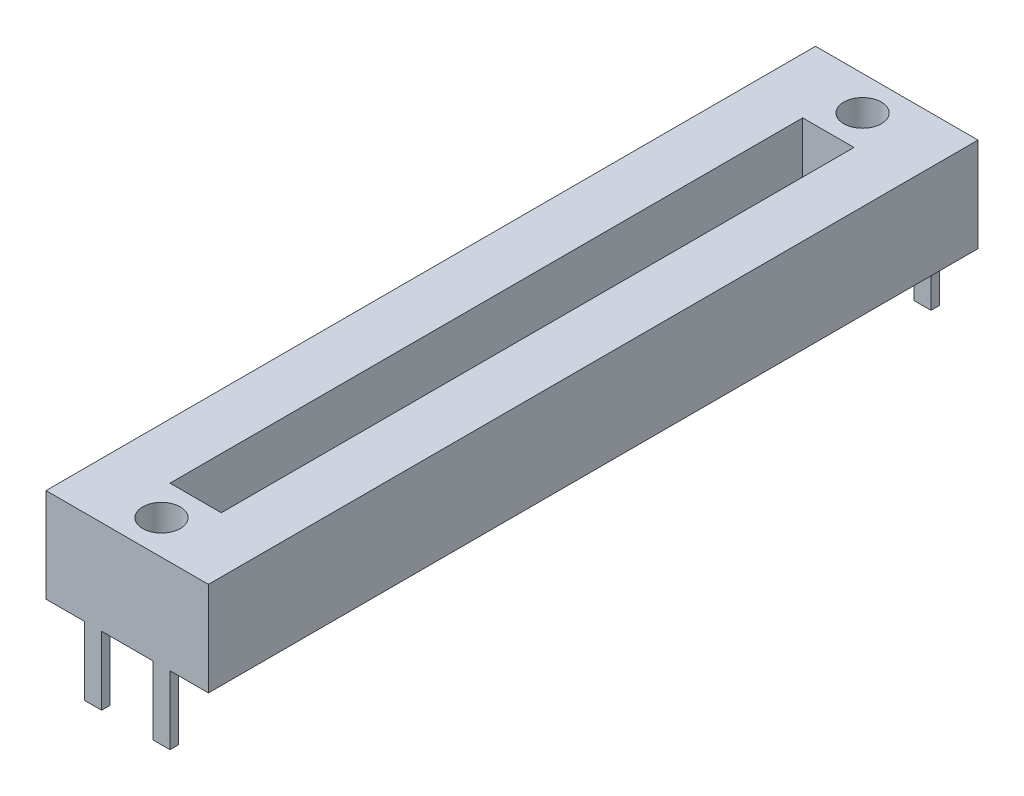
ISO-10303-21;
HEADER;
FILE_DESCRIPTION(('STEP AP214'),'2;1');
FILE_NAME('part.step','',(''),(''),'','','');
FILE_SCHEMA(('AUTOMOTIVE_DESIGN { 1 0 10303 214 1 1 1 1 }'));
ENDSEC;
DATA;
#1=APPLICATION_CONTEXT('core data for automotive mechanical design processes');
#2=APPLICATION_PROTOCOL_DEFINITION('international standard','automotive_design',2000,#1);
#3=PRODUCT_CONTEXT('',#1,'mechanical');
#4=PRODUCT('Part','Part','',(#3));
#5=PRODUCT_RELATED_PRODUCT_CATEGORY('part','',(#4));
#6=PRODUCT_DEFINITION_FORMATION('','',#4);
#7=PRODUCT_DEFINITION_CONTEXT('part definition',#1,'design');
#8=PRODUCT_DEFINITION('design','',#6,#7);
#9=PRODUCT_DEFINITION_SHAPE('','',#8);
#10=(LENGTH_UNIT() NAMED_UNIT(*) SI_UNIT(.MILLI.,.METRE.));
#11=(NAMED_UNIT(*) PLANE_ANGLE_UNIT() SI_UNIT($,.RADIAN.));
#12=(NAMED_UNIT(*) SI_UNIT($,.STERADIAN.) SOLID_ANGLE_UNIT());
#13=UNCERTAINTY_MEASURE_WITH_UNIT(LENGTH_MEASURE(1.E-05),#10,'distance_accuracy_value','');
#14=(GEOMETRIC_REPRESENTATION_CONTEXT(3) GLOBAL_UNCERTAINTY_ASSIGNED_CONTEXT((#13)) GLOBAL_UNIT_ASSIGNED_CONTEXT((#10,
#11,#12)) REPRESENTATION_CONTEXT('',''));
#15=CARTESIAN_POINT('',(0.,0.,0.));
#16=DIRECTION('',(0.,0.,1.));
#17=DIRECTION('',(1.,0.,0.));
#18=AXIS2_PLACEMENT_3D('',#15,#16,#17);
#19=CARTESIAN_POINT('',(0.,0.,0.));
#20=DIRECTION('',(0.,-1.,0.));
#21=DIRECTION('',(0.,0.,-1.));
#22=AXIS2_PLACEMENT_3D('',#19,#20,#21);
#23=PLANE('',#22);
#24=DIRECTION('',(1.,0.,0.));
#25=VECTOR('',#24,1.);
#26=CARTESIAN_POINT('',(-4.75,0.,22.5));
#27=LINE('',#26,#25);
#28=CARTESIAN_POINT('',(2.5,0.,22.5));
#29=VERTEX_POINT('',#28);
#30=CARTESIAN_POINT('',(4.75,0.,22.5));
#31=VERTEX_POINT('',#30);
#32=EDGE_CURVE('E318',#29,#31,#27,.T.);
#33=ORIENTED_EDGE('',*,*,#32,.F.);
#34=DIRECTION('',(0.,0.,1.));
#35=VECTOR('',#34,1.);
#36=CARTESIAN_POINT('',(2.5,0.,22.5));
#37=LINE('',#36,#35);
#38=CARTESIAN_POINT('',(2.5,0.,22.));
#39=VERTEX_POINT('',#38);
#40=EDGE_CURVE('E50',#39,#29,#37,.T.);
#41=ORIENTED_EDGE('',*,*,#40,.F.);
#42=DIRECTION('',(1.,0.,0.));
#43=VECTOR('',#42,1.);
#44=CARTESIAN_POINT('',(2.5,0.,22.));
#45=LINE('',#44,#43);
#46=CARTESIAN_POINT('',(1.5,0.,22.));
#47=VERTEX_POINT('',#46);
#48=EDGE_CURVE('E192',#47,#39,#45,.T.);
#49=ORIENTED_EDGE('',*,*,#48,.F.);
#50=DIRECTION('',(0.,0.,-1.));
#51=VECTOR('',#50,1.);
#52=CARTESIAN_POINT('',(1.5,0.,22.5));
#53=LINE('',#52,#51);
#54=CARTESIAN_POINT('',(1.5,0.,22.5));
#55=VERTEX_POINT('',#54);
#56=EDGE_CURVE('E475',#55,#47,#53,.T.);
#57=ORIENTED_EDGE('',*,*,#56,.F.);
#58=CARTESIAN_POINT('',(-1.5,0.,22.5));
#59=VERTEX_POINT('',#58);
#60=EDGE_CURVE('E320',#59,#55,#27,.T.);
#61=ORIENTED_EDGE('',*,*,#60,.F.);
#62=DIRECTION('',(0.,0.,1.));
#63=VECTOR('',#62,1.);
#64=CARTESIAN_POINT('',(-1.5,0.,22.5));
#65=LINE('',#64,#63);
#66=CARTESIAN_POINT('',(-1.5,0.,22.));
#67=VERTEX_POINT('',#66);
#68=EDGE_CURVE('E229',#67,#59,#65,.T.);
#69=ORIENTED_EDGE('',*,*,#68,.F.);
#70=DIRECTION('',(1.,0.,0.));
#71=VECTOR('',#70,1.);
#72=CARTESIAN_POINT('',(-2.5,0.,22.));
#73=LINE('',#72,#71);
#74=CARTESIAN_POINT('',(-2.5,0.,22.));
#75=VERTEX_POINT('',#74);
#76=EDGE_CURVE('E238',#75,#67,#73,.T.);
#77=ORIENTED_EDGE('',*,*,#76,.F.);
#78=DIRECTION('',(0.,0.,-1.));
#79=VECTOR('',#78,1.);
#80=CARTESIAN_POINT('',(-2.5,0.,22.5));
#81=LINE('',#80,#79);
#82=CARTESIAN_POINT('',(-2.5,0.,22.5));
#83=VERTEX_POINT('',#82);
#84=EDGE_CURVE('E224',#83,#75,#81,.T.);
#85=ORIENTED_EDGE('',*,*,#84,.F.);
#86=CARTESIAN_POINT('',(-4.75,0.,22.5));
#87=VERTEX_POINT('',#86);
#88=EDGE_CURVE('E303',#87,#83,#27,.T.);
#89=ORIENTED_EDGE('',*,*,#88,.F.);
#90=DIRECTION('',(0.,0.,1.));
#91=VECTOR('',#90,1.);
#92=CARTESIAN_POINT('',(-4.75,0.,22.5));
#93=LINE('',#92,#91);
#94=CARTESIAN_POINT('',(-4.75,0.,-22.5));
#95=VERTEX_POINT('',#94);
#96=EDGE_CURVE('E316',#95,#87,#93,.T.);
#97=ORIENTED_EDGE('',*,*,#96,.F.);
#98=DIRECTION('',(-1.,0.,0.));
#99=VECTOR('',#98,1.);
#100=CARTESIAN_POINT('',(-4.75,0.,-22.5));
#101=LINE('',#100,#99);
#102=CARTESIAN_POINT('',(1.5,0.,-22.5));
#103=VERTEX_POINT('',#102);
#104=EDGE_CURVE('E312',#103,#95,#101,.T.);
#105=ORIENTED_EDGE('',*,*,#104,.F.);
#106=DIRECTION('',(0.,0.,-1.));
#107=VECTOR('',#106,1.);
#108=CARTESIAN_POINT('',(1.5,0.,-22.5));
#109=LINE('',#108,#107);
#110=CARTESIAN_POINT('',(1.5,0.,-22.));
#111=VERTEX_POINT('',#110);
#112=EDGE_CURVE('E207',#111,#103,#109,.T.);
#113=ORIENTED_EDGE('',*,*,#112,.F.);
#114=DIRECTION('',(-1.,0.,0.));
#115=VECTOR('',#114,1.);
#116=CARTESIAN_POINT('',(2.5,0.,-22.));
#117=LINE('',#116,#115);
#118=CARTESIAN_POINT('',(2.5,0.,-22.));
#119=VERTEX_POINT('',#118);
#120=EDGE_CURVE('E197',#119,#111,#117,.T.);
#121=ORIENTED_EDGE('',*,*,#120,.F.);
#122=DIRECTION('',(0.,0.,1.));
#123=VECTOR('',#122,1.);
#124=CARTESIAN_POINT('',(2.5,0.,-22.5));
#125=LINE('',#124,#123);
#126=CARTESIAN_POINT('',(2.5,0.,-22.5));
#127=VERTEX_POINT('',#126);
#128=EDGE_CURVE('E195',#127,#119,#125,.T.);
#129=ORIENTED_EDGE('',*,*,#128,.F.);
#130=CARTESIAN_POINT('',(4.75,0.,-22.5));
#131=VERTEX_POINT('',#130);
#132=EDGE_CURVE('E313',#131,#127,#101,.T.);
#133=ORIENTED_EDGE('',*,*,#132,.F.);
#134=DIRECTION('',(0.,0.,-1.));
#135=VECTOR('',#134,1.);
#136=CARTESIAN_POINT('',(4.75,0.,22.5));
#137=LINE('',#136,#135);
#138=EDGE_CURVE('E292',#31,#131,#137,.T.);
#139=ORIENTED_EDGE('',*,*,#138,.F.);
#140=EDGE_LOOP('',(#33,#41,#49,#57,#61,#69,#77,#85,#89,#97,#105,#113,#121,#129,#133,#139));
#141=FACE_BOUND('',#140,.T.);
#142=ADVANCED_FACE('F35',(#141),#23,.T.);
#143=CARTESIAN_POINT('',(4.75,5.5,22.5));
#144=DIRECTION('',(-1.,0.,0.));
#145=DIRECTION('',(0.,0.,1.));
#146=AXIS2_PLACEMENT_3D('',#143,#144,#145);
#147=PLANE('',#146);
#148=ORIENTED_EDGE('',*,*,#138,.T.);
#149=DIRECTION('',(0.,-1.,0.));
#150=VECTOR('',#149,1.);
#151=CARTESIAN_POINT('',(4.75,5.5,-22.5));
#152=LINE('',#151,#150);
#153=CARTESIAN_POINT('',(4.75,5.5,-22.5));
#154=VERTEX_POINT('',#153);
#155=EDGE_CURVE('E11',#154,#131,#152,.T.);
#156=ORIENTED_EDGE('',*,*,#155,.F.);
#157=DIRECTION('',(0.,0.,-1.));
#158=VECTOR('',#157,1.);
#159=CARTESIAN_POINT('',(4.75,5.5,22.5));
#160=LINE('',#159,#158);
#161=CARTESIAN_POINT('',(4.75,5.5,22.5));
#162=VERTEX_POINT('',#161);
#163=EDGE_CURVE('E299',#162,#154,#160,.T.);
#164=ORIENTED_EDGE('',*,*,#163,.F.);
#165=DIRECTION('',(0.,-1.,0.));
#166=VECTOR('',#165,1.);
#167=CARTESIAN_POINT('',(4.75,5.5,22.5));
#168=LINE('',#167,#166);
#169=EDGE_CURVE('E309',#162,#31,#168,.T.);
#170=ORIENTED_EDGE('',*,*,#169,.T.);
#171=EDGE_LOOP('',(#148,#156,#164,#170));
#172=FACE_BOUND('',#171,.T.);
#173=ADVANCED_FACE('F37',(#172),#147,.F.);
#174=CARTESIAN_POINT('',(-4.75,5.5,-22.5));
#175=DIRECTION('',(0.,0.,1.));
#176=DIRECTION('',(1.,0.,0.));
#177=AXIS2_PLACEMENT_3D('',#174,#175,#176);
#178=PLANE('',#177);
#179=ORIENTED_EDGE('',*,*,#132,.T.);
#180=DIRECTION('',(0.,1.,0.));
#181=VECTOR('',#180,1.);
#182=CARTESIAN_POINT('',(2.5,-4.,-22.5));
#183=LINE('',#182,#181);
#184=CARTESIAN_POINT('',(2.5,-4.,-22.5));
#185=VERTEX_POINT('',#184);
#186=EDGE_CURVE('E222',#185,#127,#183,.T.);
#187=ORIENTED_EDGE('',*,*,#186,.F.);
#188=DIRECTION('',(1.,0.,0.));
#189=VECTOR('',#188,1.);
#190=CARTESIAN_POINT('',(2.5,-4.,-22.5));
#191=LINE('',#190,#189);
#192=CARTESIAN_POINT('',(1.5,-4.,-22.5));
#193=VERTEX_POINT('',#192);
#194=EDGE_CURVE('E203',#193,#185,#191,.T.);
#195=ORIENTED_EDGE('',*,*,#194,.F.);
#196=DIRECTION('',(0.,1.,0.));
#197=VECTOR('',#196,1.);
#198=CARTESIAN_POINT('',(1.5,-4.,-22.5));
#199=LINE('',#198,#197);
#200=EDGE_CURVE('E212',#193,#103,#199,.T.);
#201=ORIENTED_EDGE('',*,*,#200,.T.);
#202=ORIENTED_EDGE('',*,*,#104,.T.);
#203=DIRECTION('',(0.,-1.,0.));
#204=VECTOR('',#203,1.);
#205=CARTESIAN_POINT('',(-4.75,5.5,-22.5));
#206=LINE('',#205,#204);
#207=CARTESIAN_POINT('',(-4.75,5.5,-22.5));
#208=VERTEX_POINT('',#207);
#209=EDGE_CURVE('E43',#208,#95,#206,.T.);
#210=ORIENTED_EDGE('',*,*,#209,.F.);
#211=DIRECTION('',(-1.,0.,0.));
#212=VECTOR('',#211,1.);
#213=CARTESIAN_POINT('',(-4.75,5.5,-22.5));
#214=LINE('',#213,#212);
#215=EDGE_CURVE('E302',#154,#208,#214,.T.);
#216=ORIENTED_EDGE('',*,*,#215,.F.);
#217=ORIENTED_EDGE('',*,*,#155,.T.);
#218=EDGE_LOOP('',(#179,#187,#195,#201,#202,#210,#216,#217));
#219=FACE_BOUND('',#218,.T.);
#220=ADVANCED_FACE('F370',(#219),#178,.F.);
#221=CARTESIAN_POINT('',(-4.75,5.5,22.5));
#222=DIRECTION('',(1.,0.,0.));
#223=DIRECTION('',(0.,0.,-1.));
#224=AXIS2_PLACEMENT_3D('',#221,#222,#223);
#225=PLANE('',#224);
#226=ORIENTED_EDGE('',*,*,#96,.T.);
#227=DIRECTION('',(0.,-1.,0.));
#228=VECTOR('',#227,1.);
#229=CARTESIAN_POINT('',(-4.75,5.5,22.5));
#230=LINE('',#229,#228);
#231=CARTESIAN_POINT('',(-4.75,5.5,22.5));
#232=VERTEX_POINT('',#231);
#233=EDGE_CURVE('E323',#232,#87,#230,.T.);
#234=ORIENTED_EDGE('',*,*,#233,.F.);
#235=DIRECTION('',(0.,0.,1.));
#236=VECTOR('',#235,1.);
#237=CARTESIAN_POINT('',(-4.75,5.5,22.5));
#238=LINE('',#237,#236);
#239=EDGE_CURVE('E305',#208,#232,#238,.T.);
#240=ORIENTED_EDGE('',*,*,#239,.F.);
#241=ORIENTED_EDGE('',*,*,#209,.T.);
#242=EDGE_LOOP('',(#226,#234,#240,#241));
#243=FACE_BOUND('',#242,.T.);
#244=ADVANCED_FACE('F330',(#243),#225,.F.);
#245=CARTESIAN_POINT('',(-4.75,5.5,22.5));
#246=DIRECTION('',(0.,0.,-1.));
#247=DIRECTION('',(-1.,0.,0.));
#248=AXIS2_PLACEMENT_3D('',#245,#246,#247);
#249=PLANE('',#248);
#250=ORIENTED_EDGE('',*,*,#88,.T.);
#251=DIRECTION('',(0.,1.,0.));
#252=VECTOR('',#251,1.);
#253=CARTESIAN_POINT('',(-2.5,-4.,22.5));
#254=LINE('',#253,#252);
#255=CARTESIAN_POINT('',(-2.5,-4.,22.5));
#256=VERTEX_POINT('',#255);
#257=EDGE_CURVE('E251',#256,#83,#254,.T.);
#258=ORIENTED_EDGE('',*,*,#257,.F.);
#259=DIRECTION('',(-1.,0.,0.));
#260=VECTOR('',#259,1.);
#261=CARTESIAN_POINT('',(-2.5,-4.,22.5));
#262=LINE('',#261,#260);
#263=CARTESIAN_POINT('',(-1.5,-4.,22.5));
#264=VERTEX_POINT('',#263);
#265=EDGE_CURVE('E225',#264,#256,#262,.T.);
#266=ORIENTED_EDGE('',*,*,#265,.F.);
#267=DIRECTION('',(0.,1.,0.));
#268=VECTOR('',#267,1.);
#269=CARTESIAN_POINT('',(-1.5,-4.,22.5));
#270=LINE('',#269,#268);
#271=EDGE_CURVE('E235',#264,#59,#270,.T.);
#272=ORIENTED_EDGE('',*,*,#271,.T.);
#273=ORIENTED_EDGE('',*,*,#60,.T.);
#274=DIRECTION('',(0.,1.,0.));
#275=VECTOR('',#274,1.);
#276=CARTESIAN_POINT('',(1.5,-4.,22.5));
#277=LINE('',#276,#275);
#278=CARTESIAN_POINT('',(1.5,-4.,22.5));
#279=VERTEX_POINT('',#278);
#280=EDGE_CURVE('E181',#279,#55,#277,.T.);
#281=ORIENTED_EDGE('',*,*,#280,.F.);
#282=DIRECTION('',(-1.,0.,0.));
#283=VECTOR('',#282,1.);
#284=CARTESIAN_POINT('',(2.5,-4.,22.5));
#285=LINE('',#284,#283);
#286=CARTESIAN_POINT('',(2.5,-4.,22.5));
#287=VERTEX_POINT('',#286);
#288=EDGE_CURVE('E174',#287,#279,#285,.T.);
#289=ORIENTED_EDGE('',*,*,#288,.F.);
#290=DIRECTION('',(0.,1.,0.));
#291=VECTOR('',#290,1.);
#292=CARTESIAN_POINT('',(2.5,-4.,22.5));
#293=LINE('',#292,#291);
#294=EDGE_CURVE('E178',#287,#29,#293,.T.);
#295=ORIENTED_EDGE('',*,*,#294,.T.);
#296=ORIENTED_EDGE('',*,*,#32,.T.);
#297=ORIENTED_EDGE('',*,*,#169,.F.);
#298=DIRECTION('',(1.,0.,0.));
#299=VECTOR('',#298,1.);
#300=CARTESIAN_POINT('',(-4.75,5.5,22.5));
#301=LINE('',#300,#299);
#302=EDGE_CURVE('E307',#232,#162,#301,.T.);
#303=ORIENTED_EDGE('',*,*,#302,.F.);
#304=ORIENTED_EDGE('',*,*,#233,.T.);
#305=EDGE_LOOP('',(#250,#258,#266,#272,#273,#281,#289,#295,#296,#297,#303,#304));
#306=FACE_BOUND('',#305,.T.);
#307=ADVANCED_FACE('F177',(#306),#249,.F.);
#308=CARTESIAN_POINT('',(0.,5.5,0.));
#309=DIRECTION('',(0.,-1.,0.));
#310=DIRECTION('',(0.,0.,-1.));
#311=AXIS2_PLACEMENT_3D('',#308,#309,#310);
#312=PLANE('',#311);
#313=CARTESIAN_POINT('',(0.,5.5,20.5));
#314=DIRECTION('',(0.,1.,0.));
#315=DIRECTION('',(0.,0.,1.));
#316=AXIS2_PLACEMENT_3D('',#313,#314,#315);
#317=CIRCLE('',#316,1.1);
#318=CARTESIAN_POINT('',(0.,5.5,21.6));
#319=VERTEX_POINT('',#318);
#320=EDGE_CURVE('E259',#319,#319,#317,.T.);
#321=ORIENTED_EDGE('',*,*,#320,.F.);
#322=EDGE_LOOP('',(#321));
#323=FACE_BOUND('',#322,.T.);
#324=CARTESIAN_POINT('',(0.,5.5,-20.5));
#325=DIRECTION('',(0.,1.,0.));
#326=DIRECTION('',(0.,0.,-1.));
#327=AXIS2_PLACEMENT_3D('',#324,#325,#326);
#328=CIRCLE('',#327,1.1);
#329=CARTESIAN_POINT('',(0.,5.5,-21.6));
#330=VERTEX_POINT('',#329);
#331=EDGE_CURVE('E254',#330,#330,#328,.T.);
#332=ORIENTED_EDGE('',*,*,#331,.F.);
#333=EDGE_LOOP('',(#332));
#334=FACE_BOUND('',#333,.T.);
#335=DIRECTION('',(-1.,0.,0.));
#336=VECTOR('',#335,1.);
#337=CARTESIAN_POINT('',(-1.5,5.5,-18.5));
#338=LINE('',#337,#336);
#339=CARTESIAN_POINT('',(1.5,5.5,-18.5));
#340=VERTEX_POINT('',#339);
#341=CARTESIAN_POINT('',(-1.5,5.5,-18.5));
#342=VERTEX_POINT('',#341);
#343=EDGE_CURVE('E282',#340,#342,#338,.T.);
#344=ORIENTED_EDGE('',*,*,#343,.F.);
#345=DIRECTION('',(0.,0.,-1.));
#346=VECTOR('',#345,1.);
#347=CARTESIAN_POINT('',(1.5,5.5,18.5));
#348=LINE('',#347,#346);
#349=CARTESIAN_POINT('',(1.5,5.5,18.5));
#350=VERTEX_POINT('',#349);
#351=EDGE_CURVE('E258',#350,#340,#348,.T.);
#352=ORIENTED_EDGE('',*,*,#351,.F.);
#353=DIRECTION('',(1.,0.,0.));
#354=VECTOR('',#353,1.);
#355=CARTESIAN_POINT('',(-1.5,5.5,18.5));
#356=LINE('',#355,#354);
#357=CARTESIAN_POINT('',(-1.5,5.5,18.5));
#358=VERTEX_POINT('',#357);
#359=EDGE_CURVE('E271',#358,#350,#356,.T.);
#360=ORIENTED_EDGE('',*,*,#359,.F.);
#361=DIRECTION('',(0.,0.,1.));
#362=VECTOR('',#361,1.);
#363=CARTESIAN_POINT('',(-1.5,5.5,18.5));
#364=LINE('',#363,#362);
#365=EDGE_CURVE('E285',#342,#358,#364,.T.);
#366=ORIENTED_EDGE('',*,*,#365,.F.);
#367=EDGE_LOOP('',(#344,#352,#360,#366));
#368=FACE_BOUND('',#367,.T.);
#369=ORIENTED_EDGE('',*,*,#163,.T.);
#370=ORIENTED_EDGE('',*,*,#215,.T.);
#371=ORIENTED_EDGE('',*,*,#239,.T.);
#372=ORIENTED_EDGE('',*,*,#302,.T.);
#373=EDGE_LOOP('',(#369,#370,#371,#372));
#374=FACE_BOUND('',#373,.T.);
#375=ADVANCED_FACE('F374',(#323,#334,#368,#374),#312,.F.);
#376=CARTESIAN_POINT('',(1.5,2.5,18.5));
#377=DIRECTION('',(1.,0.,0.));
#378=DIRECTION('',(0.,0.,-1.));
#379=AXIS2_PLACEMENT_3D('',#376,#377,#378);
#380=PLANE('',#379);
#381=ORIENTED_EDGE('',*,*,#351,.T.);
#382=DIRECTION('',(0.,1.,0.));
#383=VECTOR('',#382,1.);
#384=CARTESIAN_POINT('',(1.5,2.5,-18.5));
#385=LINE('',#384,#383);
#386=CARTESIAN_POINT('',(1.5,2.5,-18.5));
#387=VERTEX_POINT('',#386);
#388=EDGE_CURVE('E280',#387,#340,#385,.T.);
#389=ORIENTED_EDGE('',*,*,#388,.F.);
#390=DIRECTION('',(0.,0.,-1.));
#391=VECTOR('',#390,1.);
#392=CARTESIAN_POINT('',(1.5,2.5,18.5));
#393=LINE('',#392,#391);
#394=CARTESIAN_POINT('',(1.5,2.5,18.5));
#395=VERTEX_POINT('',#394);
#396=EDGE_CURVE('E267',#395,#387,#393,.T.);
#397=ORIENTED_EDGE('',*,*,#396,.F.);
#398=DIRECTION('',(0.,1.,0.));
#399=VECTOR('',#398,1.);
#400=CARTESIAN_POINT('',(1.5,2.5,18.5));
#401=LINE('',#400,#399);
#402=EDGE_CURVE('E290',#395,#350,#401,.T.);
#403=ORIENTED_EDGE('',*,*,#402,.T.);
#404=EDGE_LOOP('',(#381,#389,#397,#403));
#405=FACE_BOUND('',#404,.T.);
#406=ADVANCED_FACE('F486',(#405),#380,.F.);
#407=CARTESIAN_POINT('',(-1.5,2.5,18.5));
#408=DIRECTION('',(0.,0.,1.));
#409=DIRECTION('',(1.,0.,0.));
#410=AXIS2_PLACEMENT_3D('',#407,#408,#409);
#411=PLANE('',#410);
#412=ORIENTED_EDGE('',*,*,#359,.T.);
#413=ORIENTED_EDGE('',*,*,#402,.F.);
#414=DIRECTION('',(1.,0.,0.));
#415=VECTOR('',#414,1.);
#416=CARTESIAN_POINT('',(-1.5,2.5,18.5));
#417=LINE('',#416,#415);
#418=CARTESIAN_POINT('',(-1.5,2.5,18.5));
#419=VERTEX_POINT('',#418);
#420=EDGE_CURVE('E277',#419,#395,#417,.T.);
#421=ORIENTED_EDGE('',*,*,#420,.F.);
#422=DIRECTION('',(0.,1.,0.));
#423=VECTOR('',#422,1.);
#424=CARTESIAN_POINT('',(-1.5,2.5,18.5));
#425=LINE('',#424,#423);
#426=EDGE_CURVE('E293',#419,#358,#425,.T.);
#427=ORIENTED_EDGE('',*,*,#426,.T.);
#428=EDGE_LOOP('',(#412,#413,#421,#427));
#429=FACE_BOUND('',#428,.T.);
#430=ADVANCED_FACE('F491',(#429),#411,.F.);
#431=CARTESIAN_POINT('',(-1.5,2.5,18.5));
#432=DIRECTION('',(-1.,0.,0.));
#433=DIRECTION('',(0.,0.,1.));
#434=AXIS2_PLACEMENT_3D('',#431,#432,#433);
#435=PLANE('',#434);
#436=ORIENTED_EDGE('',*,*,#365,.T.);
#437=ORIENTED_EDGE('',*,*,#426,.F.);
#438=DIRECTION('',(0.,0.,1.));
#439=VECTOR('',#438,1.);
#440=CARTESIAN_POINT('',(-1.5,2.5,18.5));
#441=LINE('',#440,#439);
#442=CARTESIAN_POINT('',(-1.5,2.5,-18.5));
#443=VERTEX_POINT('',#442);
#444=EDGE_CURVE('E274',#443,#419,#441,.T.);
#445=ORIENTED_EDGE('',*,*,#444,.F.);
#446=DIRECTION('',(0.,1.,0.));
#447=VECTOR('',#446,1.);
#448=CARTESIAN_POINT('',(-1.5,2.5,-18.5));
#449=LINE('',#448,#447);
#450=EDGE_CURVE('E295',#443,#342,#449,.T.);
#451=ORIENTED_EDGE('',*,*,#450,.T.);
#452=EDGE_LOOP('',(#436,#437,#445,#451));
#453=FACE_BOUND('',#452,.T.);
#454=ADVANCED_FACE('F509',(#453),#435,.F.);
#455=CARTESIAN_POINT('',(-1.5,2.5,-18.5));
#456=DIRECTION('',(0.,0.,-1.));
#457=DIRECTION('',(-1.,0.,0.));
#458=AXIS2_PLACEMENT_3D('',#455,#456,#457);
#459=PLANE('',#458);
#460=ORIENTED_EDGE('',*,*,#343,.T.);
#461=ORIENTED_EDGE('',*,*,#450,.F.);
#462=DIRECTION('',(-1.,0.,0.));
#463=VECTOR('',#462,1.);
#464=CARTESIAN_POINT('',(-1.5,2.5,-18.5));
#465=LINE('',#464,#463);
#466=EDGE_CURVE('E270',#387,#443,#465,.T.);
#467=ORIENTED_EDGE('',*,*,#466,.F.);
#468=ORIENTED_EDGE('',*,*,#388,.T.);
#469=EDGE_LOOP('',(#460,#461,#467,#468));
#470=FACE_BOUND('',#469,.T.);
#471=ADVANCED_FACE('F502',(#470),#459,.F.);
#472=CARTESIAN_POINT('',(0.,2.5,0.));
#473=DIRECTION('',(0.,-1.,0.));
#474=DIRECTION('',(0.,0.,-1.));
#475=AXIS2_PLACEMENT_3D('',#472,#473,#474);
#476=PLANE('',#475);
#477=ORIENTED_EDGE('',*,*,#396,.T.);
#478=ORIENTED_EDGE('',*,*,#466,.T.);
#479=ORIENTED_EDGE('',*,*,#444,.T.);
#480=ORIENTED_EDGE('',*,*,#420,.T.);
#481=EDGE_LOOP('',(#477,#478,#479,#480));
#482=FACE_BOUND('',#481,.T.);
#483=ADVANCED_FACE('F511',(#482),#476,.F.);
#484=CARTESIAN_POINT('',(0.,2.5,-20.5));
#485=DIRECTION('',(0.,1.,0.));
#486=DIRECTION('',(0.,0.,1.));
#487=AXIS2_PLACEMENT_3D('',#484,#485,#486);
#488=CYLINDRICAL_SURFACE('',#487,1.1);
#489=CARTESIAN_POINT('',(0.,2.5,-20.5));
#490=DIRECTION('',(0.,1.,0.));
#491=DIRECTION('',(0.,0.,-1.));
#492=AXIS2_PLACEMENT_3D('',#489,#490,#491);
#493=CIRCLE('',#492,1.1);
#494=CARTESIAN_POINT('',(0.,2.5,-21.6));
#495=VERTEX_POINT('',#494);
#496=EDGE_CURVE('E262',#495,#495,#493,.T.);
#497=ORIENTED_EDGE('',*,*,#496,.F.);
#498=EDGE_LOOP('',(#497));
#499=FACE_BOUND('',#498,.T.);
#500=ORIENTED_EDGE('',*,*,#331,.T.);
#501=EDGE_LOOP('',(#500));
#502=FACE_BOUND('',#501,.T.);
#503=ADVANCED_FACE('F513',(#499,#502),#488,.F.);
#504=CARTESIAN_POINT('',(0.,2.5,-20.5));
#505=DIRECTION('',(0.,-1.,0.));
#506=DIRECTION('',(0.,0.,-1.));
#507=AXIS2_PLACEMENT_3D('',#504,#505,#506);
#508=PLANE('',#507);
#509=ORIENTED_EDGE('',*,*,#496,.T.);
#510=EDGE_LOOP('',(#509));
#511=FACE_BOUND('',#510,.T.);
#512=ADVANCED_FACE('F519',(#511),#508,.F.);
#513=CARTESIAN_POINT('',(0.,2.5,20.5));
#514=DIRECTION('',(0.,1.,0.));
#515=DIRECTION('',(0.,0.,1.));
#516=AXIS2_PLACEMENT_3D('',#513,#514,#515);
#517=CYLINDRICAL_SURFACE('',#516,1.1);
#518=CARTESIAN_POINT('',(0.,2.5,20.5));
#519=DIRECTION('',(0.,1.,0.));
#520=DIRECTION('',(0.,0.,1.));
#521=AXIS2_PLACEMENT_3D('',#518,#519,#520);
#522=CIRCLE('',#521,1.1);
#523=CARTESIAN_POINT('',(0.,2.5,21.6));
#524=VERTEX_POINT('',#523);
#525=EDGE_CURVE('E255',#524,#524,#522,.T.);
#526=ORIENTED_EDGE('',*,*,#525,.F.);
#527=EDGE_LOOP('',(#526));
#528=FACE_BOUND('',#527,.T.);
#529=ORIENTED_EDGE('',*,*,#320,.T.);
#530=EDGE_LOOP('',(#529));
#531=FACE_BOUND('',#530,.T.);
#532=ADVANCED_FACE('F561',(#528,#531),#517,.F.);
#533=CARTESIAN_POINT('',(0.,2.5,20.5));
#534=DIRECTION('',(0.,1.,0.));
#535=DIRECTION('',(0.,0.,1.));
#536=AXIS2_PLACEMENT_3D('',#533,#534,#535);
#537=PLANE('',#536);
#538=ORIENTED_EDGE('',*,*,#525,.T.);
#539=EDGE_LOOP('',(#538));
#540=FACE_BOUND('',#539,.T.);
#541=ADVANCED_FACE('F361',(#540),#537,.T.);
#542=CARTESIAN_POINT('',(-2.5,-4.,22.5));
#543=DIRECTION('',(1.,0.,0.));
#544=DIRECTION('',(0.,0.,-1.));
#545=AXIS2_PLACEMENT_3D('',#542,#543,#544);
#546=PLANE('',#545);
#547=ORIENTED_EDGE('',*,*,#84,.T.);
#548=DIRECTION('',(0.,1.,0.));
#549=VECTOR('',#548,1.);
#550=CARTESIAN_POINT('',(-2.5,-4.,22.));
#551=LINE('',#550,#549);
#552=CARTESIAN_POINT('',(-2.5,-4.,22.));
#553=VERTEX_POINT('',#552);
#554=EDGE_CURVE('E248',#553,#75,#551,.T.);
#555=ORIENTED_EDGE('',*,*,#554,.F.);
#556=DIRECTION('',(0.,0.,-1.));
#557=VECTOR('',#556,1.);
#558=CARTESIAN_POINT('',(-2.5,-4.,22.5));
#559=LINE('',#558,#557);
#560=EDGE_CURVE('E228',#256,#553,#559,.T.);
#561=ORIENTED_EDGE('',*,*,#560,.F.);
#562=ORIENTED_EDGE('',*,*,#257,.T.);
#563=EDGE_LOOP('',(#547,#555,#561,#562));
#564=FACE_BOUND('',#563,.T.);
#565=ADVANCED_FACE('F341',(#564),#546,.F.);
#566=CARTESIAN_POINT('',(-2.5,-4.,22.));
#567=DIRECTION('',(0.,0.,1.));
#568=DIRECTION('',(1.,0.,0.));
#569=AXIS2_PLACEMENT_3D('',#566,#567,#568);
#570=PLANE('',#569);
#571=ORIENTED_EDGE('',*,*,#76,.T.);
#572=DIRECTION('',(0.,1.,0.));
#573=VECTOR('',#572,1.);
#574=CARTESIAN_POINT('',(-1.5,-4.,22.));
#575=LINE('',#574,#573);
#576=CARTESIAN_POINT('',(-1.5,-4.,22.));
#577=VERTEX_POINT('',#576);
#578=EDGE_CURVE('E245',#577,#67,#575,.T.);
#579=ORIENTED_EDGE('',*,*,#578,.F.);
#580=DIRECTION('',(1.,0.,0.));
#581=VECTOR('',#580,1.);
#582=CARTESIAN_POINT('',(-2.5,-4.,22.));
#583=LINE('',#582,#581);
#584=EDGE_CURVE('E231',#553,#577,#583,.T.);
#585=ORIENTED_EDGE('',*,*,#584,.F.);
#586=ORIENTED_EDGE('',*,*,#554,.T.);
#587=EDGE_LOOP('',(#571,#579,#585,#586));
#588=FACE_BOUND('',#587,.T.);
#589=ADVANCED_FACE('F353',(#588),#570,.F.);
#590=CARTESIAN_POINT('',(-1.5,-4.,22.5));
#591=DIRECTION('',(-1.,0.,0.));
#592=DIRECTION('',(0.,0.,1.));
#593=AXIS2_PLACEMENT_3D('',#590,#591,#592);
#594=PLANE('',#593);
#595=ORIENTED_EDGE('',*,*,#68,.T.);
#596=ORIENTED_EDGE('',*,*,#271,.F.);
#597=DIRECTION('',(0.,0.,1.));
#598=VECTOR('',#597,1.);
#599=CARTESIAN_POINT('',(-1.5,-4.,22.5));
#600=LINE('',#599,#598);
#601=EDGE_CURVE('E233',#577,#264,#600,.T.);
#602=ORIENTED_EDGE('',*,*,#601,.F.);
#603=ORIENTED_EDGE('',*,*,#578,.T.);
#604=EDGE_LOOP('',(#595,#596,#602,#603));
#605=FACE_BOUND('',#604,.T.);
#606=ADVANCED_FACE('F349',(#605),#594,.F.);
#607=CARTESIAN_POINT('',(0.,-4.,0.));
#608=DIRECTION('',(0.,1.,0.));
#609=DIRECTION('',(0.,0.,1.));
#610=AXIS2_PLACEMENT_3D('',#607,#608,#609);
#611=PLANE('',#610);
#612=ORIENTED_EDGE('',*,*,#265,.T.);
#613=ORIENTED_EDGE('',*,*,#560,.T.);
#614=ORIENTED_EDGE('',*,*,#584,.T.);
#615=ORIENTED_EDGE('',*,*,#601,.T.);
#616=EDGE_LOOP('',(#612,#613,#614,#615));
#617=FACE_BOUND('',#616,.T.);
#618=ADVANCED_FACE('F345',(#617),#611,.F.);
#619=CARTESIAN_POINT('',(2.5,-4.,-22.5));
#620=DIRECTION('',(-1.,0.,0.));
#621=DIRECTION('',(0.,0.,1.));
#622=AXIS2_PLACEMENT_3D('',#619,#620,#621);
#623=PLANE('',#622);
#624=ORIENTED_EDGE('',*,*,#128,.T.);
#625=DIRECTION('',(0.,1.,0.));
#626=VECTOR('',#625,1.);
#627=CARTESIAN_POINT('',(2.5,-4.,-22.));
#628=LINE('',#627,#626);
#629=CARTESIAN_POINT('',(2.5,-4.,-22.));
#630=VERTEX_POINT('',#629);
#631=EDGE_CURVE('E219',#630,#119,#628,.T.);
#632=ORIENTED_EDGE('',*,*,#631,.F.);
#633=DIRECTION('',(0.,0.,1.));
#634=VECTOR('',#633,1.);
#635=CARTESIAN_POINT('',(2.5,-4.,-22.5));
#636=LINE('',#635,#634);
#637=EDGE_CURVE('E206',#185,#630,#636,.T.);
#638=ORIENTED_EDGE('',*,*,#637,.F.);
#639=ORIENTED_EDGE('',*,*,#186,.T.);
#640=EDGE_LOOP('',(#624,#632,#638,#639));
#641=FACE_BOUND('',#640,.T.);
#642=ADVANCED_FACE('F389',(#641),#623,.F.);
#643=CARTESIAN_POINT('',(2.5,-4.,-22.));
#644=DIRECTION('',(0.,0.,-1.));
#645=DIRECTION('',(-1.,0.,0.));
#646=AXIS2_PLACEMENT_3D('',#643,#644,#645);
#647=PLANE('',#646);
#648=ORIENTED_EDGE('',*,*,#120,.T.);
#649=DIRECTION('',(0.,1.,0.));
#650=VECTOR('',#649,1.);
#651=CARTESIAN_POINT('',(1.5,-4.,-22.));
#652=LINE('',#651,#650);
#653=CARTESIAN_POINT('',(1.5,-4.,-22.));
#654=VERTEX_POINT('',#653);
#655=EDGE_CURVE('E58',#654,#111,#652,.T.);
#656=ORIENTED_EDGE('',*,*,#655,.F.);
#657=DIRECTION('',(-1.,0.,0.));
#658=VECTOR('',#657,1.);
#659=CARTESIAN_POINT('',(2.5,-4.,-22.));
#660=LINE('',#659,#658);
#661=EDGE_CURVE('E209',#630,#654,#660,.T.);
#662=ORIENTED_EDGE('',*,*,#661,.F.);
#663=ORIENTED_EDGE('',*,*,#631,.T.);
#664=EDGE_LOOP('',(#648,#656,#662,#663));
#665=FACE_BOUND('',#664,.T.);
#666=ADVANCED_FACE('F392',(#665),#647,.F.);
#667=CARTESIAN_POINT('',(1.5,-4.,-22.5));
#668=DIRECTION('',(1.,0.,0.));
#669=DIRECTION('',(0.,0.,-1.));
#670=AXIS2_PLACEMENT_3D('',#667,#668,#669);
#671=PLANE('',#670);
#672=ORIENTED_EDGE('',*,*,#112,.T.);
#673=ORIENTED_EDGE('',*,*,#200,.F.);
#674=DIRECTION('',(0.,0.,-1.));
#675=VECTOR('',#674,1.);
#676=CARTESIAN_POINT('',(1.5,-4.,-22.5));
#677=LINE('',#676,#675);
#678=EDGE_CURVE('E211',#654,#193,#677,.T.);
#679=ORIENTED_EDGE('',*,*,#678,.F.);
#680=ORIENTED_EDGE('',*,*,#655,.T.);
#681=EDGE_LOOP('',(#672,#673,#679,#680));
#682=FACE_BOUND('',#681,.T.);
#683=ADVANCED_FACE('F396',(#682),#671,.F.);
#684=CARTESIAN_POINT('',(0.,-4.,0.));
#685=DIRECTION('',(0.,1.,0.));
#686=DIRECTION('',(0.,0.,1.));
#687=AXIS2_PLACEMENT_3D('',#684,#685,#686);
#688=PLANE('',#687);
#689=ORIENTED_EDGE('',*,*,#194,.T.);
#690=ORIENTED_EDGE('',*,*,#637,.T.);
#691=ORIENTED_EDGE('',*,*,#661,.T.);
#692=ORIENTED_EDGE('',*,*,#678,.T.);
#693=EDGE_LOOP('',(#689,#690,#691,#692));
#694=FACE_BOUND('',#693,.T.);
#695=ADVANCED_FACE('F394',(#694),#688,.F.);
#696=CARTESIAN_POINT('',(2.5,-4.,22.5));
#697=DIRECTION('',(-1.,0.,0.));
#698=DIRECTION('',(0.,0.,1.));
#699=AXIS2_PLACEMENT_3D('',#696,#697,#698);
#700=PLANE('',#699);
#701=ORIENTED_EDGE('',*,*,#40,.T.);
#702=ORIENTED_EDGE('',*,*,#294,.F.);
#703=DIRECTION('',(0.,0.,1.));
#704=VECTOR('',#703,1.);
#705=CARTESIAN_POINT('',(2.5,-4.,22.5));
#706=LINE('',#705,#704);
#707=CARTESIAN_POINT('',(2.5,-4.,22.));
#708=VERTEX_POINT('',#707);
#709=EDGE_CURVE('E185',#708,#287,#706,.T.);
#710=ORIENTED_EDGE('',*,*,#709,.F.);
#711=DIRECTION('',(0.,1.,0.));
#712=VECTOR('',#711,1.);
#713=CARTESIAN_POINT('',(2.5,-4.,22.));
#714=LINE('',#713,#712);
#715=EDGE_CURVE('E473',#708,#39,#714,.T.);
#716=ORIENTED_EDGE('',*,*,#715,.T.);
#717=EDGE_LOOP('',(#701,#702,#710,#716));
#718=FACE_BOUND('',#717,.T.);
#719=ADVANCED_FACE('F194',(#718),#700,.F.);
#720=CARTESIAN_POINT('',(1.5,-4.,22.5));
#721=DIRECTION('',(1.,0.,0.));
#722=DIRECTION('',(0.,0.,-1.));
#723=AXIS2_PLACEMENT_3D('',#720,#721,#722);
#724=PLANE('',#723);
#725=ORIENTED_EDGE('',*,*,#56,.T.);
#726=DIRECTION('',(0.,1.,0.));
#727=VECTOR('',#726,1.);
#728=CARTESIAN_POINT('',(1.5,-4.,22.));
#729=LINE('',#728,#727);
#730=CARTESIAN_POINT('',(1.5,-4.,22.));
#731=VERTEX_POINT('',#730);
#732=EDGE_CURVE('E199',#731,#47,#729,.T.);
#733=ORIENTED_EDGE('',*,*,#732,.F.);
#734=DIRECTION('',(0.,0.,-1.));
#735=VECTOR('',#734,1.);
#736=CARTESIAN_POINT('',(1.5,-4.,22.5));
#737=LINE('',#736,#735);
#738=EDGE_CURVE('E184',#279,#731,#737,.T.);
#739=ORIENTED_EDGE('',*,*,#738,.F.);
#740=ORIENTED_EDGE('',*,*,#280,.T.);
#741=EDGE_LOOP('',(#725,#733,#739,#740));
#742=FACE_BOUND('',#741,.T.);
#743=ADVANCED_FACE('F441',(#742),#724,.F.);
#744=CARTESIAN_POINT('',(2.5,-4.,22.));
#745=DIRECTION('',(0.,0.,1.));
#746=DIRECTION('',(1.,0.,0.));
#747=AXIS2_PLACEMENT_3D('',#744,#745,#746);
#748=PLANE('',#747);
#749=ORIENTED_EDGE('',*,*,#48,.T.);
#750=ORIENTED_EDGE('',*,*,#715,.F.);
#751=DIRECTION('',(1.,0.,0.));
#752=VECTOR('',#751,1.);
#753=CARTESIAN_POINT('',(2.5,-4.,22.));
#754=LINE('',#753,#752);
#755=EDGE_CURVE('E190',#731,#708,#754,.T.);
#756=ORIENTED_EDGE('',*,*,#755,.F.);
#757=ORIENTED_EDGE('',*,*,#732,.T.);
#758=EDGE_LOOP('',(#749,#750,#756,#757));
#759=FACE_BOUND('',#758,.T.);
#760=ADVANCED_FACE('F449',(#759),#748,.F.);
#761=CARTESIAN_POINT('',(0.,-4.,0.));
#762=DIRECTION('',(0.,1.,0.));
#763=DIRECTION('',(0.,0.,1.));
#764=AXIS2_PLACEMENT_3D('',#761,#762,#763);
#765=PLANE('',#764);
#766=ORIENTED_EDGE('',*,*,#709,.T.);
#767=ORIENTED_EDGE('',*,*,#288,.T.);
#768=ORIENTED_EDGE('',*,*,#738,.T.);
#769=ORIENTED_EDGE('',*,*,#755,.T.);
#770=EDGE_LOOP('',(#766,#767,#768,#769));
#771=FACE_BOUND('',#770,.T.);
#772=ADVANCED_FACE('F188',(#771),#765,.F.);
#773=CLOSED_SHELL('',(#142,#173,#220,#244,#307,#375,#406,#430,#454,#471,#483,#503,#512,#532,
#541,#565,#589,#606,#618,#642,#666,#683,#695,#719,#743,#760,#772));
#774=MANIFOLD_SOLID_BREP('B2',#773);
#775=ADVANCED_BREP_SHAPE_REPRESENTATION('',(#18,#774),#14);
#776=SHAPE_DEFINITION_REPRESENTATION(#9,#775);
ENDSEC;
END-ISO-10303-21;
